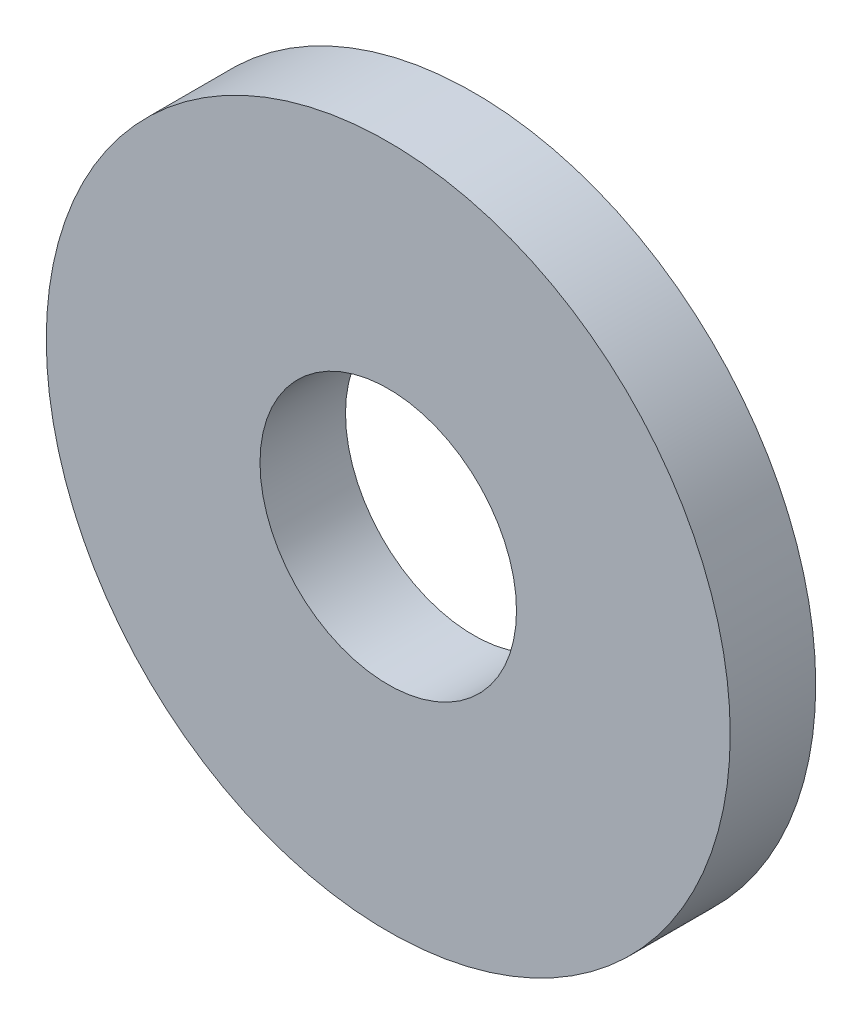
ISO-10303-21;
HEADER;
FILE_DESCRIPTION(('STEP AP214'),'2;1');
FILE_NAME('part.step','',(''),(''),'','','');
FILE_SCHEMA(('AUTOMOTIVE_DESIGN { 1 0 10303 214 1 1 1 1 }'));
ENDSEC;
DATA;
#1=APPLICATION_CONTEXT('core data for automotive mechanical design processes');
#2=APPLICATION_PROTOCOL_DEFINITION('international standard','automotive_design',2000,#1);
#3=PRODUCT_CONTEXT('',#1,'mechanical');
#4=PRODUCT('Part','Part','',(#3));
#5=PRODUCT_RELATED_PRODUCT_CATEGORY('part','',(#4));
#6=PRODUCT_DEFINITION_FORMATION('','',#4);
#7=PRODUCT_DEFINITION_CONTEXT('part definition',#1,'design');
#8=PRODUCT_DEFINITION('design','',#6,#7);
#9=PRODUCT_DEFINITION_SHAPE('','',#8);
#10=(LENGTH_UNIT() NAMED_UNIT(*) SI_UNIT(.MILLI.,.METRE.));
#11=(NAMED_UNIT(*) PLANE_ANGLE_UNIT() SI_UNIT($,.RADIAN.));
#12=(NAMED_UNIT(*) SI_UNIT($,.STERADIAN.) SOLID_ANGLE_UNIT());
#13=UNCERTAINTY_MEASURE_WITH_UNIT(LENGTH_MEASURE(1.E-05),#10,'distance_accuracy_value','');
#14=(GEOMETRIC_REPRESENTATION_CONTEXT(3) GLOBAL_UNCERTAINTY_ASSIGNED_CONTEXT((#13)) GLOBAL_UNIT_ASSIGNED_CONTEXT((#10,
#11,#12)) REPRESENTATION_CONTEXT('',''));
#15=CARTESIAN_POINT('',(0.,0.,0.));
#16=DIRECTION('',(0.,0.,1.));
#17=DIRECTION('',(1.,0.,0.));
#18=AXIS2_PLACEMENT_3D('',#15,#16,#17);
#19=CARTESIAN_POINT('',(0.,0.,2.));
#20=DIRECTION('',(0.,0.,1.));
#21=DIRECTION('',(1.,0.,0.));
#22=AXIS2_PLACEMENT_3D('',#19,#20,#21);
#23=PLANE('',#22);
#24=CARTESIAN_POINT('',(0.,0.,2.));
#25=DIRECTION('',(0.,0.,1.));
#26=DIRECTION('',(1.,0.,0.));
#27=AXIS2_PLACEMENT_3D('',#24,#25,#26);
#28=CIRCLE('',#27,8.);
#29=CARTESIAN_POINT('',(8.,0.,2.));
#30=VERTEX_POINT('',#29);
#31=EDGE_CURVE('E10',#30,#30,#28,.T.);
#32=ORIENTED_EDGE('',*,*,#31,.T.);
#33=EDGE_LOOP('',(#32));
#34=FACE_BOUND('',#33,.T.);
#35=CARTESIAN_POINT('',(0.,0.,2.));
#36=DIRECTION('',(0.,0.,1.));
#37=DIRECTION('',(1.,0.,0.));
#38=AXIS2_PLACEMENT_3D('',#35,#36,#37);
#39=CIRCLE('',#38,3.);
#40=CARTESIAN_POINT('',(3.,0.,2.));
#41=VERTEX_POINT('',#40);
#42=EDGE_CURVE('E48',#41,#41,#39,.T.);
#43=ORIENTED_EDGE('',*,*,#42,.F.);
#44=EDGE_LOOP('',(#43));
#45=FACE_BOUND('',#44,.T.);
#46=ADVANCED_FACE('F37',(#34,#45),#23,.T.);
#47=CARTESIAN_POINT('',(0.,0.,0.));
#48=DIRECTION('',(0.,0.,1.));
#49=DIRECTION('',(1.,0.,0.));
#50=AXIS2_PLACEMENT_3D('',#47,#48,#49);
#51=PLANE('',#50);
#52=CARTESIAN_POINT('',(0.,0.,0.));
#53=DIRECTION('',(0.,0.,1.));
#54=DIRECTION('',(1.,0.,0.));
#55=AXIS2_PLACEMENT_3D('',#52,#53,#54);
#56=CIRCLE('',#55,8.);
#57=CARTESIAN_POINT('',(8.,0.,0.));
#58=VERTEX_POINT('',#57);
#59=EDGE_CURVE('E41',#58,#58,#56,.T.);
#60=ORIENTED_EDGE('',*,*,#59,.F.);
#61=EDGE_LOOP('',(#60));
#62=FACE_BOUND('',#61,.T.);
#63=CARTESIAN_POINT('',(0.,0.,0.));
#64=DIRECTION('',(0.,0.,1.));
#65=DIRECTION('',(1.,0.,0.));
#66=AXIS2_PLACEMENT_3D('',#63,#64,#65);
#67=CIRCLE('',#66,3.);
#68=CARTESIAN_POINT('',(3.,0.,0.));
#69=VERTEX_POINT('',#68);
#70=EDGE_CURVE('E50',#69,#69,#67,.T.);
#71=ORIENTED_EDGE('',*,*,#70,.T.);
#72=EDGE_LOOP('',(#71));
#73=FACE_BOUND('',#72,.T.);
#74=ADVANCED_FACE('F60',(#62,#73),#51,.F.);
#75=CARTESIAN_POINT('',(0.,0.,2.));
#76=DIRECTION('',(0.,0.,-1.));
#77=DIRECTION('',(-1.,0.,0.));
#78=AXIS2_PLACEMENT_3D('',#75,#76,#77);
#79=CYLINDRICAL_SURFACE('',#78,8.);
#80=ORIENTED_EDGE('',*,*,#31,.F.);
#81=EDGE_LOOP('',(#80));
#82=FACE_BOUND('',#81,.T.);
#83=ORIENTED_EDGE('',*,*,#59,.T.);
#84=EDGE_LOOP('',(#83));
#85=FACE_BOUND('',#84,.T.);
#86=ADVANCED_FACE('F39',(#82,#85),#79,.T.);
#87=CARTESIAN_POINT('',(0.,0.,2.));
#88=DIRECTION('',(0.,0.,-1.));
#89=DIRECTION('',(-1.,0.,0.));
#90=AXIS2_PLACEMENT_3D('',#87,#88,#89);
#91=CYLINDRICAL_SURFACE('',#90,3.);
#92=ORIENTED_EDGE('',*,*,#42,.T.);
#93=EDGE_LOOP('',(#92));
#94=FACE_BOUND('',#93,.T.);
#95=ORIENTED_EDGE('',*,*,#70,.F.);
#96=EDGE_LOOP('',(#95));
#97=FACE_BOUND('',#96,.T.);
#98=ADVANCED_FACE('F56',(#94,#97),#91,.F.);
#99=CLOSED_SHELL('',(#46,#74,#86,#98));
#100=MANIFOLD_SOLID_BREP('B2',#99);
#101=ADVANCED_BREP_SHAPE_REPRESENTATION('',(#18,#100),#14);
#102=SHAPE_DEFINITION_REPRESENTATION(#9,#101);
ENDSEC;
END-ISO-10303-21;
